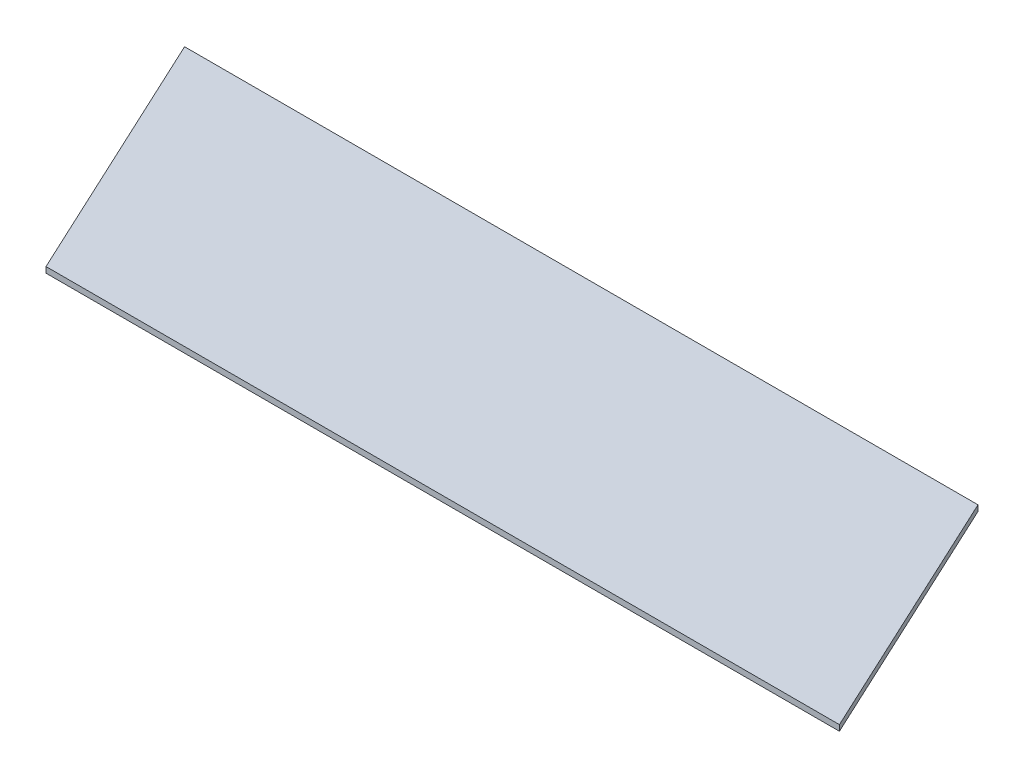
ISO-10303-21;
HEADER;
FILE_DESCRIPTION(('STEP AP214'),'2;1');
FILE_NAME('part.step','',(''),(''),'','','');
FILE_SCHEMA(('AUTOMOTIVE_DESIGN { 1 0 10303 214 1 1 1 1 }'));
ENDSEC;
DATA;
#1=APPLICATION_CONTEXT('core data for automotive mechanical design processes');
#2=APPLICATION_PROTOCOL_DEFINITION('international standard','automotive_design',2000,#1);
#3=PRODUCT_CONTEXT('',#1,'mechanical');
#4=PRODUCT('Part','Part','',(#3));
#5=PRODUCT_RELATED_PRODUCT_CATEGORY('part','',(#4));
#6=PRODUCT_DEFINITION_FORMATION('','',#4);
#7=PRODUCT_DEFINITION_CONTEXT('part definition',#1,'design');
#8=PRODUCT_DEFINITION('design','',#6,#7);
#9=PRODUCT_DEFINITION_SHAPE('','',#8);
#10=(LENGTH_UNIT() NAMED_UNIT(*) SI_UNIT(.MILLI.,.METRE.));
#11=(NAMED_UNIT(*) PLANE_ANGLE_UNIT() SI_UNIT($,.RADIAN.));
#12=(NAMED_UNIT(*) SI_UNIT($,.STERADIAN.) SOLID_ANGLE_UNIT());
#13=UNCERTAINTY_MEASURE_WITH_UNIT(LENGTH_MEASURE(1.E-05),#10,'distance_accuracy_value','');
#14=(GEOMETRIC_REPRESENTATION_CONTEXT(3) GLOBAL_UNCERTAINTY_ASSIGNED_CONTEXT((#13)) GLOBAL_UNIT_ASSIGNED_CONTEXT((#10,
#11,#12)) REPRESENTATION_CONTEXT('',''));
#15=CARTESIAN_POINT('',(0.,0.,0.));
#16=DIRECTION('',(0.,0.,1.));
#17=DIRECTION('',(1.,0.,0.));
#18=AXIS2_PLACEMENT_3D('',#15,#16,#17);
#19=CARTESIAN_POINT('',(0.,0.4,0.));
#20=DIRECTION('',(0.906307787036651,0.,-0.422618261740697));
#21=DIRECTION('',(-0.422618261740697,0.,-0.906307787036651));
#22=AXIS2_PLACEMENT_3D('',#19,#20,#21);
#23=PLANE('',#22);
#24=DIRECTION('',(0.422618261740697,0.,0.906307787036651));
#25=VECTOR('',#24,1.);
#26=CARTESIAN_POINT('',(0.,0.,0.));
#27=LINE('',#26,#25);
#28=CARTESIAN_POINT('',(0.,0.,0.));
#29=VERTEX_POINT('',#28);
#30=CARTESIAN_POINT('',(8.39353784678991,0.,18.));
#31=VERTEX_POINT('',#30);
#32=EDGE_CURVE('E102',#29,#31,#27,.T.);
#33=ORIENTED_EDGE('',*,*,#32,.T.);
#34=DIRECTION('',(0.,-1.,0.));
#35=VECTOR('',#34,1.);
#36=CARTESIAN_POINT('',(8.39353784678991,0.4,18.));
#37=LINE('',#36,#35);
#38=CARTESIAN_POINT('',(8.39353784678991,0.4,18.));
#39=VERTEX_POINT('',#38);
#40=EDGE_CURVE('E11',#39,#31,#37,.T.);
#41=ORIENTED_EDGE('',*,*,#40,.F.);
#42=DIRECTION('',(0.422618261740697,0.,0.906307787036651));
#43=VECTOR('',#42,1.);
#44=CARTESIAN_POINT('',(0.,0.4,0.));
#45=LINE('',#44,#43);
#46=CARTESIAN_POINT('',(0.,0.4,0.));
#47=VERTEX_POINT('',#46);
#48=EDGE_CURVE('E90',#47,#39,#45,.T.);
#49=ORIENTED_EDGE('',*,*,#48,.F.);
#50=DIRECTION('',(0.,-1.,0.));
#51=VECTOR('',#50,1.);
#52=CARTESIAN_POINT('',(0.,0.4,0.));
#53=LINE('',#52,#51);
#54=EDGE_CURVE('E98',#47,#29,#53,.T.);
#55=ORIENTED_EDGE('',*,*,#54,.T.);
#56=EDGE_LOOP('',(#33,#41,#49,#55));
#57=FACE_BOUND('',#56,.T.);
#58=ADVANCED_FACE('F39',(#57),#23,.F.);
#59=CARTESIAN_POINT('',(63.3935378467899,0.4,18.));
#60=DIRECTION('',(0.,0.,-1.));
#61=DIRECTION('',(-1.,0.,0.));
#62=AXIS2_PLACEMENT_3D('',#59,#60,#61);
#63=PLANE('',#62);
#64=DIRECTION('',(1.,0.,0.));
#65=VECTOR('',#64,1.);
#66=CARTESIAN_POINT('',(63.3935378467899,0.,18.));
#67=LINE('',#66,#65);
#68=CARTESIAN_POINT('',(63.3935378467899,0.,18.));
#69=VERTEX_POINT('',#68);
#70=EDGE_CURVE('E94',#31,#69,#67,.T.);
#71=ORIENTED_EDGE('',*,*,#70,.T.);
#72=DIRECTION('',(0.,-1.,0.));
#73=VECTOR('',#72,1.);
#74=CARTESIAN_POINT('',(63.3935378467899,0.4,18.));
#75=LINE('',#74,#73);
#76=CARTESIAN_POINT('',(63.3935378467899,0.4,18.));
#77=VERTEX_POINT('',#76);
#78=EDGE_CURVE('E47',#77,#69,#75,.T.);
#79=ORIENTED_EDGE('',*,*,#78,.F.);
#80=DIRECTION('',(1.,0.,0.));
#81=VECTOR('',#80,1.);
#82=CARTESIAN_POINT('',(63.3935378467899,0.4,18.));
#83=LINE('',#82,#81);
#84=EDGE_CURVE('E85',#39,#77,#83,.T.);
#85=ORIENTED_EDGE('',*,*,#84,.F.);
#86=ORIENTED_EDGE('',*,*,#40,.T.);
#87=EDGE_LOOP('',(#71,#79,#85,#86));
#88=FACE_BOUND('',#87,.T.);
#89=ADVANCED_FACE('F93',(#88),#63,.F.);
#90=CARTESIAN_POINT('',(55.,0.4,0.));
#91=DIRECTION('',(-0.906307787036651,0.,0.422618261740698));
#92=DIRECTION('',(0.422618261740698,0.,0.906307787036651));
#93=AXIS2_PLACEMENT_3D('',#90,#91,#92);
#94=PLANE('',#93);
#95=DIRECTION('',(-0.422618261740698,0.,-0.906307787036651));
#96=VECTOR('',#95,1.);
#97=CARTESIAN_POINT('',(55.,0.,0.));
#98=LINE('',#97,#96);
#99=CARTESIAN_POINT('',(55.,0.,0.));
#100=VERTEX_POINT('',#99);
#101=EDGE_CURVE('E72',#69,#100,#98,.T.);
#102=ORIENTED_EDGE('',*,*,#101,.T.);
#103=DIRECTION('',(0.,-1.,0.));
#104=VECTOR('',#103,1.);
#105=CARTESIAN_POINT('',(55.,0.4,0.));
#106=LINE('',#105,#104);
#107=CARTESIAN_POINT('',(55.,0.4,0.));
#108=VERTEX_POINT('',#107);
#109=EDGE_CURVE('E95',#108,#100,#106,.T.);
#110=ORIENTED_EDGE('',*,*,#109,.F.);
#111=DIRECTION('',(-0.422618261740698,0.,-0.906307787036651));
#112=VECTOR('',#111,1.);
#113=CARTESIAN_POINT('',(55.,0.4,0.));
#114=LINE('',#113,#112);
#115=EDGE_CURVE('E88',#77,#108,#114,.T.);
#116=ORIENTED_EDGE('',*,*,#115,.F.);
#117=ORIENTED_EDGE('',*,*,#78,.T.);
#118=EDGE_LOOP('',(#102,#110,#116,#117));
#119=FACE_BOUND('',#118,.T.);
#120=ADVANCED_FACE('F96',(#119),#94,.F.);
#121=CARTESIAN_POINT('',(0.,0.4,0.));
#122=DIRECTION('',(0.,0.,1.));
#123=DIRECTION('',(1.,0.,0.));
#124=AXIS2_PLACEMENT_3D('',#121,#122,#123);
#125=PLANE('',#124);
#126=DIRECTION('',(-1.,0.,0.));
#127=VECTOR('',#126,1.);
#128=CARTESIAN_POINT('',(0.,0.,0.));
#129=LINE('',#128,#127);
#130=EDGE_CURVE('E78',#100,#29,#129,.T.);
#131=ORIENTED_EDGE('',*,*,#130,.T.);
#132=ORIENTED_EDGE('',*,*,#54,.F.);
#133=DIRECTION('',(-1.,0.,0.));
#134=VECTOR('',#133,1.);
#135=CARTESIAN_POINT('',(0.,0.4,0.));
#136=LINE('',#135,#134);
#137=EDGE_CURVE('E55',#108,#47,#136,.T.);
#138=ORIENTED_EDGE('',*,*,#137,.F.);
#139=ORIENTED_EDGE('',*,*,#109,.T.);
#140=EDGE_LOOP('',(#131,#132,#138,#139));
#141=FACE_BOUND('',#140,.T.);
#142=ADVANCED_FACE('F109',(#141),#125,.F.);
#143=CARTESIAN_POINT('',(0.,0.4,0.));
#144=DIRECTION('',(0.,-1.,0.));
#145=DIRECTION('',(0.,0.,-1.));
#146=AXIS2_PLACEMENT_3D('',#143,#144,#145);
#147=PLANE('',#146);
#148=ORIENTED_EDGE('',*,*,#48,.T.);
#149=ORIENTED_EDGE('',*,*,#84,.T.);
#150=ORIENTED_EDGE('',*,*,#115,.T.);
#151=ORIENTED_EDGE('',*,*,#137,.T.);
#152=EDGE_LOOP('',(#148,#149,#150,#151));
#153=FACE_BOUND('',#152,.T.);
#154=ADVANCED_FACE('F86',(#153),#147,.F.);
#155=CARTESIAN_POINT('',(0.,0.,0.));
#156=DIRECTION('',(0.,-1.,0.));
#157=DIRECTION('',(0.,0.,-1.));
#158=AXIS2_PLACEMENT_3D('',#155,#156,#157);
#159=PLANE('',#158);
#160=ORIENTED_EDGE('',*,*,#32,.F.);
#161=ORIENTED_EDGE('',*,*,#130,.F.);
#162=ORIENTED_EDGE('',*,*,#101,.F.);
#163=ORIENTED_EDGE('',*,*,#70,.F.);
#164=EDGE_LOOP('',(#160,#161,#162,#163));
#165=FACE_BOUND('',#164,.T.);
#166=ADVANCED_FACE('F112',(#165),#159,.T.);
#167=CLOSED_SHELL('',(#58,#89,#120,#142,#154,#166));
#168=MANIFOLD_SOLID_BREP('B2',#167);
#169=ADVANCED_BREP_SHAPE_REPRESENTATION('',(#18,#168),#14);
#170=SHAPE_DEFINITION_REPRESENTATION(#9,#169);
ENDSEC;
END-ISO-10303-21;
